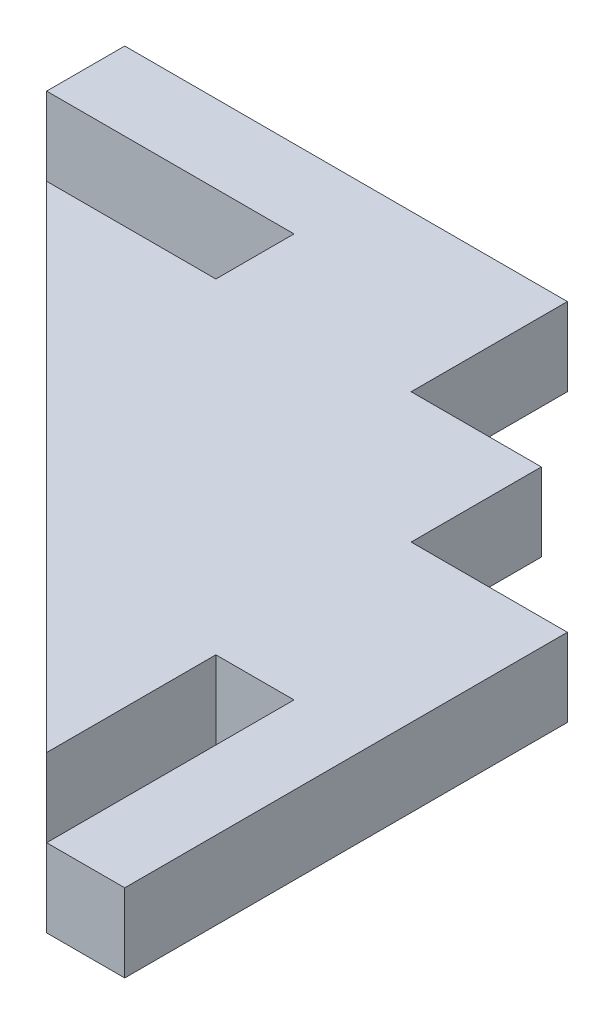
ISO-10303-21;
HEADER;
FILE_DESCRIPTION(('STEP AP214'),'2;1');
FILE_NAME('part.step','',(''),(''),'','','');
FILE_SCHEMA(('AUTOMOTIVE_DESIGN { 1 0 10303 214 1 1 1 1 }'));
ENDSEC;
DATA;
#1=APPLICATION_CONTEXT('core data for automotive mechanical design processes');
#2=APPLICATION_PROTOCOL_DEFINITION('international standard','automotive_design',2000,#1);
#3=PRODUCT_CONTEXT('',#1,'mechanical');
#4=PRODUCT('Part','Part','',(#3));
#5=PRODUCT_RELATED_PRODUCT_CATEGORY('part','',(#4));
#6=PRODUCT_DEFINITION_FORMATION('','',#4);
#7=PRODUCT_DEFINITION_CONTEXT('part definition',#1,'design');
#8=PRODUCT_DEFINITION('design','',#6,#7);
#9=PRODUCT_DEFINITION_SHAPE('','',#8);
#10=(LENGTH_UNIT() NAMED_UNIT(*) SI_UNIT(.MILLI.,.METRE.));
#11=(NAMED_UNIT(*) PLANE_ANGLE_UNIT() SI_UNIT($,.RADIAN.));
#12=(NAMED_UNIT(*) SI_UNIT($,.STERADIAN.) SOLID_ANGLE_UNIT());
#13=UNCERTAINTY_MEASURE_WITH_UNIT(LENGTH_MEASURE(1.E-05),#10,'distance_accuracy_value','');
#14=(GEOMETRIC_REPRESENTATION_CONTEXT(3) GLOBAL_UNCERTAINTY_ASSIGNED_CONTEXT((#13)) GLOBAL_UNIT_ASSIGNED_CONTEXT((#10,
#11,#12)) REPRESENTATION_CONTEXT('',''));
#15=CARTESIAN_POINT('',(0.,0.,0.));
#16=DIRECTION('',(0.,0.,1.));
#17=DIRECTION('',(1.,0.,0.));
#18=AXIS2_PLACEMENT_3D('',#15,#16,#17);
#19=CARTESIAN_POINT('',(0.,6.,10.));
#20=DIRECTION('',(-1.,0.,0.));
#21=DIRECTION('',(0.,0.,1.));
#22=AXIS2_PLACEMENT_3D('',#19,#20,#21);
#23=PLANE('',#22);
#24=DIRECTION('',(0.,0.,-1.));
#25=VECTOR('',#24,1.);
#26=CARTESIAN_POINT('',(0.,0.,10.));
#27=LINE('',#26,#25);
#28=CARTESIAN_POINT('',(0.,0.,10.));
#29=VERTEX_POINT('',#28);
#30=CARTESIAN_POINT('',(0.,0.,0.));
#31=VERTEX_POINT('',#30);
#32=EDGE_CURVE('E223',#29,#31,#27,.T.);
#33=ORIENTED_EDGE('',*,*,#32,.T.);
#34=DIRECTION('',(0.,-1.,0.));
#35=VECTOR('',#34,1.);
#36=CARTESIAN_POINT('',(0.,6.,0.));
#37=LINE('',#36,#35);
#38=CARTESIAN_POINT('',(0.,6.,0.));
#39=VERTEX_POINT('',#38);
#40=EDGE_CURVE('E51',#39,#31,#37,.T.);
#41=ORIENTED_EDGE('',*,*,#40,.F.);
#42=DIRECTION('',(0.,0.,-1.));
#43=VECTOR('',#42,1.);
#44=CARTESIAN_POINT('',(0.,6.,10.));
#45=LINE('',#44,#43);
#46=CARTESIAN_POINT('',(0.,6.,10.));
#47=VERTEX_POINT('',#46);
#48=EDGE_CURVE('E196',#47,#39,#45,.T.);
#49=ORIENTED_EDGE('',*,*,#48,.F.);
#50=DIRECTION('',(0.,-1.,0.));
#51=VECTOR('',#50,1.);
#52=CARTESIAN_POINT('',(0.,6.,10.));
#53=LINE('',#52,#51);
#54=EDGE_CURVE('E197',#47,#29,#53,.T.);
#55=ORIENTED_EDGE('',*,*,#54,.T.);
#56=EDGE_LOOP('',(#33,#41,#49,#55));
#57=FACE_BOUND('',#56,.T.);
#58=ADVANCED_FACE('F43',(#57),#23,.F.);
#59=CARTESIAN_POINT('',(0.,6.,0.));
#60=DIRECTION('',(0.,0.,1.));
#61=DIRECTION('',(1.,0.,0.));
#62=AXIS2_PLACEMENT_3D('',#59,#60,#61);
#63=PLANE('',#62);
#64=DIRECTION('',(-1.,0.,0.));
#65=VECTOR('',#64,1.);
#66=CARTESIAN_POINT('',(0.,0.,0.));
#67=LINE('',#66,#65);
#68=CARTESIAN_POINT('',(-10.,0.,0.));
#69=VERTEX_POINT('',#68);
#70=EDGE_CURVE('E187',#31,#69,#67,.T.);
#71=ORIENTED_EDGE('',*,*,#70,.T.);
#72=DIRECTION('',(0.,-1.,0.));
#73=VECTOR('',#72,1.);
#74=CARTESIAN_POINT('',(-10.,6.,0.));
#75=LINE('',#74,#73);
#76=CARTESIAN_POINT('',(-10.,6.,0.));
#77=VERTEX_POINT('',#76);
#78=EDGE_CURVE('E208',#77,#69,#75,.T.);
#79=ORIENTED_EDGE('',*,*,#78,.F.);
#80=DIRECTION('',(-1.,0.,0.));
#81=VECTOR('',#80,1.);
#82=CARTESIAN_POINT('',(0.,6.,0.));
#83=LINE('',#82,#81);
#84=EDGE_CURVE('E218',#39,#77,#83,.T.);
#85=ORIENTED_EDGE('',*,*,#84,.F.);
#86=ORIENTED_EDGE('',*,*,#40,.T.);
#87=EDGE_LOOP('',(#71,#79,#85,#86));
#88=FACE_BOUND('',#87,.T.);
#89=ADVANCED_FACE('F216',(#88),#63,.F.);
#90=CARTESIAN_POINT('',(-10.,6.,0.));
#91=DIRECTION('',(-1.,0.,0.));
#92=DIRECTION('',(0.,0.,1.));
#93=AXIS2_PLACEMENT_3D('',#90,#91,#92);
#94=PLANE('',#93);
#95=DIRECTION('',(0.,0.,-1.));
#96=VECTOR('',#95,1.);
#97=CARTESIAN_POINT('',(-10.,0.,0.));
#98=LINE('',#97,#96);
#99=CARTESIAN_POINT('',(-10.,0.,-12.));
#100=VERTEX_POINT('',#99);
#101=EDGE_CURVE('E180',#69,#100,#98,.T.);
#102=ORIENTED_EDGE('',*,*,#101,.T.);
#103=DIRECTION('',(0.,-1.,0.));
#104=VECTOR('',#103,1.);
#105=CARTESIAN_POINT('',(-10.,6.,-12.));
#106=LINE('',#105,#104);
#107=CARTESIAN_POINT('',(-10.,6.,-12.));
#108=VERTEX_POINT('',#107);
#109=EDGE_CURVE('E177',#108,#100,#106,.T.);
#110=ORIENTED_EDGE('',*,*,#109,.F.);
#111=DIRECTION('',(0.,0.,-1.));
#112=VECTOR('',#111,1.);
#113=CARTESIAN_POINT('',(-10.,6.,0.));
#114=LINE('',#113,#112);
#115=EDGE_CURVE('E247',#77,#108,#114,.T.);
#116=ORIENTED_EDGE('',*,*,#115,.F.);
#117=ORIENTED_EDGE('',*,*,#78,.T.);
#118=EDGE_LOOP('',(#102,#110,#116,#117));
#119=FACE_BOUND('',#118,.T.);
#120=ADVANCED_FACE('F340',(#119),#94,.F.);
#121=CARTESIAN_POINT('',(-10.,6.,-12.));
#122=DIRECTION('',(0.,0.,1.));
#123=DIRECTION('',(1.,0.,0.));
#124=AXIS2_PLACEMENT_3D('',#121,#122,#123);
#125=PLANE('',#124);
#126=DIRECTION('',(-1.,0.,0.));
#127=VECTOR('',#126,1.);
#128=CARTESIAN_POINT('',(-10.,0.,-12.));
#129=LINE('',#128,#127);
#130=CARTESIAN_POINT('',(-44.,0.,-12.));
#131=VERTEX_POINT('',#130);
#132=EDGE_CURVE('E169',#100,#131,#129,.T.);
#133=ORIENTED_EDGE('',*,*,#132,.T.);
#134=DIRECTION('',(0.,1.,0.));
#135=VECTOR('',#134,1.);
#136=CARTESIAN_POINT('',(-44.,0.,-12.));
#137=LINE('',#136,#135);
#138=CARTESIAN_POINT('',(-44.,6.,-12.));
#139=VERTEX_POINT('',#138);
#140=EDGE_CURVE('E150',#131,#139,#137,.T.);
#141=ORIENTED_EDGE('',*,*,#140,.T.);
#142=DIRECTION('',(-1.,0.,0.));
#143=VECTOR('',#142,1.);
#144=CARTESIAN_POINT('',(-10.,6.,-12.));
#145=LINE('',#144,#143);
#146=EDGE_CURVE('E244',#108,#139,#145,.T.);
#147=ORIENTED_EDGE('',*,*,#146,.F.);
#148=ORIENTED_EDGE('',*,*,#109,.T.);
#149=EDGE_LOOP('',(#133,#141,#147,#148));
#150=FACE_BOUND('',#149,.T.);
#151=ADVANCED_FACE('F175',(#150),#125,.F.);
#152=CARTESIAN_POINT('',(-50.,6.,-12.));
#153=DIRECTION('',(0.707106781186547,0.,-0.707106781186547));
#154=DIRECTION('',(-0.707106781186548,0.,-0.707106781186548));
#155=AXIS2_PLACEMENT_3D('',#152,#153,#154);
#156=PLANE('',#155);
#157=DIRECTION('',(0.707106781186548,0.,0.707106781186548));
#158=VECTOR('',#157,1.);
#159=CARTESIAN_POINT('',(-50.,6.,-12.));
#160=LINE('',#159,#158);
#161=CARTESIAN_POINT('',(-38.,6.,0.));
#162=VERTEX_POINT('',#161);
#163=CARTESIAN_POINT('',(0.,6.,38.));
#164=VERTEX_POINT('',#163);
#165=EDGE_CURVE('E240',#162,#164,#160,.T.);
#166=ORIENTED_EDGE('',*,*,#165,.F.);
#167=DIRECTION('',(0.,-1.,0.));
#168=VECTOR('',#167,1.);
#169=CARTESIAN_POINT('',(-38.,6.,0.));
#170=LINE('',#169,#168);
#171=CARTESIAN_POINT('',(-38.,0.,0.));
#172=VERTEX_POINT('',#171);
#173=EDGE_CURVE('E227',#162,#172,#170,.T.);
#174=ORIENTED_EDGE('',*,*,#173,.T.);
#175=DIRECTION('',(0.707106781186548,0.,0.707106781186548));
#176=VECTOR('',#175,1.);
#177=CARTESIAN_POINT('',(-50.,0.,-12.));
#178=LINE('',#177,#176);
#179=CARTESIAN_POINT('',(0.,0.,38.));
#180=VERTEX_POINT('',#179);
#181=EDGE_CURVE('E179',#172,#180,#178,.T.);
#182=ORIENTED_EDGE('',*,*,#181,.T.);
#183=DIRECTION('',(0.,1.,0.));
#184=VECTOR('',#183,1.);
#185=CARTESIAN_POINT('',(0.,6.,38.));
#186=LINE('',#185,#184);
#187=EDGE_CURVE('E232',#180,#164,#186,.T.);
#188=ORIENTED_EDGE('',*,*,#187,.T.);
#189=EDGE_LOOP('',(#166,#174,#182,#188));
#190=FACE_BOUND('',#189,.T.);
#191=ADVANCED_FACE('F351',(#190),#156,.F.);
#192=CARTESIAN_POINT('',(12.,6.,50.));
#193=DIRECTION('',(-1.,0.,0.));
#194=DIRECTION('',(0.,0.,1.));
#195=AXIS2_PLACEMENT_3D('',#192,#193,#194);
#196=PLANE('',#195);
#197=DIRECTION('',(0.,0.,-1.));
#198=VECTOR('',#197,1.);
#199=CARTESIAN_POINT('',(12.,6.,50.));
#200=LINE('',#199,#198);
#201=CARTESIAN_POINT('',(12.,6.,44.));
#202=VERTEX_POINT('',#201);
#203=CARTESIAN_POINT('',(12.,6.,10.));
#204=VERTEX_POINT('',#203);
#205=EDGE_CURVE('E237',#202,#204,#200,.T.);
#206=ORIENTED_EDGE('',*,*,#205,.F.);
#207=DIRECTION('',(0.,1.,0.));
#208=VECTOR('',#207,1.);
#209=CARTESIAN_POINT('',(12.,0.,44.));
#210=LINE('',#209,#208);
#211=CARTESIAN_POINT('',(12.,0.,44.));
#212=VERTEX_POINT('',#211);
#213=EDGE_CURVE('E316',#212,#202,#210,.T.);
#214=ORIENTED_EDGE('',*,*,#213,.F.);
#215=DIRECTION('',(0.,0.,-1.));
#216=VECTOR('',#215,1.);
#217=CARTESIAN_POINT('',(12.,0.,50.));
#218=LINE('',#217,#216);
#219=CARTESIAN_POINT('',(12.,0.,10.));
#220=VERTEX_POINT('',#219);
#221=EDGE_CURVE('E185',#212,#220,#218,.T.);
#222=ORIENTED_EDGE('',*,*,#221,.T.);
#223=DIRECTION('',(0.,-1.,0.));
#224=VECTOR('',#223,1.);
#225=CARTESIAN_POINT('',(12.,6.,10.));
#226=LINE('',#225,#224);
#227=EDGE_CURVE('E201',#204,#220,#226,.T.);
#228=ORIENTED_EDGE('',*,*,#227,.F.);
#229=EDGE_LOOP('',(#206,#214,#222,#228));
#230=FACE_BOUND('',#229,.T.);
#231=ADVANCED_FACE('F334',(#230),#196,.F.);
#232=CARTESIAN_POINT('',(12.,6.,10.));
#233=DIRECTION('',(0.,0.,1.));
#234=DIRECTION('',(1.,0.,0.));
#235=AXIS2_PLACEMENT_3D('',#232,#233,#234);
#236=PLANE('',#235);
#237=DIRECTION('',(-1.,0.,0.));
#238=VECTOR('',#237,1.);
#239=CARTESIAN_POINT('',(12.,0.,10.));
#240=LINE('',#239,#238);
#241=EDGE_CURVE('E193',#220,#29,#240,.T.);
#242=ORIENTED_EDGE('',*,*,#241,.T.);
#243=ORIENTED_EDGE('',*,*,#54,.F.);
#244=DIRECTION('',(-1.,0.,0.));
#245=VECTOR('',#244,1.);
#246=CARTESIAN_POINT('',(12.,6.,10.));
#247=LINE('',#246,#245);
#248=EDGE_CURVE('E202',#204,#47,#247,.T.);
#249=ORIENTED_EDGE('',*,*,#248,.F.);
#250=ORIENTED_EDGE('',*,*,#227,.T.);
#251=EDGE_LOOP('',(#242,#243,#249,#250));
#252=FACE_BOUND('',#251,.T.);
#253=ADVANCED_FACE('F337',(#252),#236,.F.);
#254=CARTESIAN_POINT('',(0.,6.,0.));
#255=DIRECTION('',(0.,1.,0.));
#256=DIRECTION('',(0.,0.,1.));
#257=AXIS2_PLACEMENT_3D('',#254,#255,#256);
#258=PLANE('',#257);
#259=DIRECTION('',(0.,0.,-1.));
#260=VECTOR('',#259,1.);
#261=CARTESIAN_POINT('',(-44.,6.,-6.));
#262=LINE('',#261,#260);
#263=CARTESIAN_POINT('',(-44.,6.,-6.));
#264=VERTEX_POINT('',#263);
#265=EDGE_CURVE('E156',#264,#139,#262,.T.);
#266=ORIENTED_EDGE('',*,*,#265,.F.);
#267=DIRECTION('',(-1.,0.,0.));
#268=VECTOR('',#267,1.);
#269=CARTESIAN_POINT('',(-44.,6.,-6.));
#270=LINE('',#269,#268);
#271=CARTESIAN_POINT('',(-25.,6.,-6.));
#272=VERTEX_POINT('',#271);
#273=EDGE_CURVE('E297',#272,#264,#270,.T.);
#274=ORIENTED_EDGE('',*,*,#273,.F.);
#275=DIRECTION('',(0.,0.,-1.));
#276=VECTOR('',#275,1.);
#277=CARTESIAN_POINT('',(-25.,6.,-6.));
#278=LINE('',#277,#276);
#279=CARTESIAN_POINT('',(-25.,6.,0.));
#280=VERTEX_POINT('',#279);
#281=EDGE_CURVE('E301',#280,#272,#278,.T.);
#282=ORIENTED_EDGE('',*,*,#281,.F.);
#283=DIRECTION('',(1.,0.,0.));
#284=VECTOR('',#283,1.);
#285=CARTESIAN_POINT('',(-44.,6.,0.));
#286=LINE('',#285,#284);
#287=EDGE_CURVE('E274',#162,#280,#286,.T.);
#288=ORIENTED_EDGE('',*,*,#287,.F.);
#289=ORIENTED_EDGE('',*,*,#165,.T.);
#290=DIRECTION('',(0.,0.,1.));
#291=VECTOR('',#290,1.);
#292=CARTESIAN_POINT('',(0.,6.,44.));
#293=LINE('',#292,#291);
#294=CARTESIAN_POINT('',(0.,6.,25.));
#295=VERTEX_POINT('',#294);
#296=EDGE_CURVE('E262',#295,#164,#293,.T.);
#297=ORIENTED_EDGE('',*,*,#296,.F.);
#298=DIRECTION('',(-1.,0.,0.));
#299=VECTOR('',#298,1.);
#300=CARTESIAN_POINT('',(6.,6.,25.));
#301=LINE('',#300,#299);
#302=CARTESIAN_POINT('',(6.,6.,25.));
#303=VERTEX_POINT('',#302);
#304=EDGE_CURVE('E275',#303,#295,#301,.T.);
#305=ORIENTED_EDGE('',*,*,#304,.F.);
#306=DIRECTION('',(0.,0.,-1.));
#307=VECTOR('',#306,1.);
#308=CARTESIAN_POINT('',(6.,6.,44.));
#309=LINE('',#308,#307);
#310=CARTESIAN_POINT('',(6.,6.,44.));
#311=VERTEX_POINT('',#310);
#312=EDGE_CURVE('E270',#311,#303,#309,.T.);
#313=ORIENTED_EDGE('',*,*,#312,.F.);
#314=DIRECTION('',(-1.,0.,0.));
#315=VECTOR('',#314,1.);
#316=CARTESIAN_POINT('',(6.,6.,44.));
#317=LINE('',#316,#315);
#318=EDGE_CURVE('E315',#202,#311,#317,.T.);
#319=ORIENTED_EDGE('',*,*,#318,.F.);
#320=ORIENTED_EDGE('',*,*,#205,.T.);
#321=ORIENTED_EDGE('',*,*,#248,.T.);
#322=ORIENTED_EDGE('',*,*,#48,.T.);
#323=ORIENTED_EDGE('',*,*,#84,.T.);
#324=ORIENTED_EDGE('',*,*,#115,.T.);
#325=ORIENTED_EDGE('',*,*,#146,.T.);
#326=EDGE_LOOP('',(#266,#274,#282,#288,#289,#297,#305,#313,#319,#320,#321,#322,#323,#324,#325));
#327=FACE_BOUND('',#326,.T.);
#328=ADVANCED_FACE('F331',(#327),#258,.T.);
#329=CARTESIAN_POINT('',(0.,0.,0.));
#330=DIRECTION('',(0.,1.,0.));
#331=DIRECTION('',(0.,0.,1.));
#332=AXIS2_PLACEMENT_3D('',#329,#330,#331);
#333=PLANE('',#332);
#334=DIRECTION('',(-1.,0.,0.));
#335=VECTOR('',#334,1.);
#336=CARTESIAN_POINT('',(-44.,0.,-6.));
#337=LINE('',#336,#335);
#338=CARTESIAN_POINT('',(-25.,0.,-6.));
#339=VERTEX_POINT('',#338);
#340=CARTESIAN_POINT('',(-44.,0.,-6.));
#341=VERTEX_POINT('',#340);
#342=EDGE_CURVE('E171',#339,#341,#337,.T.);
#343=ORIENTED_EDGE('',*,*,#342,.T.);
#344=DIRECTION('',(0.,0.,-1.));
#345=VECTOR('',#344,1.);
#346=CARTESIAN_POINT('',(-44.,0.,-6.));
#347=LINE('',#346,#345);
#348=EDGE_CURVE('E153',#341,#131,#347,.T.);
#349=ORIENTED_EDGE('',*,*,#348,.T.);
#350=ORIENTED_EDGE('',*,*,#132,.F.);
#351=ORIENTED_EDGE('',*,*,#101,.F.);
#352=ORIENTED_EDGE('',*,*,#70,.F.);
#353=ORIENTED_EDGE('',*,*,#32,.F.);
#354=ORIENTED_EDGE('',*,*,#241,.F.);
#355=ORIENTED_EDGE('',*,*,#221,.F.);
#356=DIRECTION('',(-1.,0.,0.));
#357=VECTOR('',#356,1.);
#358=CARTESIAN_POINT('',(6.,0.,44.));
#359=LINE('',#358,#357);
#360=CARTESIAN_POINT('',(6.,0.,44.));
#361=VERTEX_POINT('',#360);
#362=EDGE_CURVE('E311',#212,#361,#359,.T.);
#363=ORIENTED_EDGE('',*,*,#362,.T.);
#364=DIRECTION('',(0.,0.,-1.));
#365=VECTOR('',#364,1.);
#366=CARTESIAN_POINT('',(6.,0.,44.));
#367=LINE('',#366,#365);
#368=CARTESIAN_POINT('',(6.,0.,25.));
#369=VERTEX_POINT('',#368);
#370=EDGE_CURVE('E258',#361,#369,#367,.T.);
#371=ORIENTED_EDGE('',*,*,#370,.T.);
#372=DIRECTION('',(-1.,0.,0.));
#373=VECTOR('',#372,1.);
#374=CARTESIAN_POINT('',(6.,0.,25.));
#375=LINE('',#374,#373);
#376=CARTESIAN_POINT('',(0.,0.,25.));
#377=VERTEX_POINT('',#376);
#378=EDGE_CURVE('E263',#369,#377,#375,.T.);
#379=ORIENTED_EDGE('',*,*,#378,.T.);
#380=DIRECTION('',(0.,0.,1.));
#381=VECTOR('',#380,1.);
#382=CARTESIAN_POINT('',(0.,0.,44.));
#383=LINE('',#382,#381);
#384=EDGE_CURVE('E66',#377,#180,#383,.T.);
#385=ORIENTED_EDGE('',*,*,#384,.T.);
#386=ORIENTED_EDGE('',*,*,#181,.F.);
#387=DIRECTION('',(1.,0.,0.));
#388=VECTOR('',#387,1.);
#389=CARTESIAN_POINT('',(0.,0.,0.));
#390=LINE('',#389,#388);
#391=CARTESIAN_POINT('',(-25.,0.,0.));
#392=VERTEX_POINT('',#391);
#393=EDGE_CURVE('E11',#172,#392,#390,.T.);
#394=ORIENTED_EDGE('',*,*,#393,.T.);
#395=DIRECTION('',(0.,0.,-1.));
#396=VECTOR('',#395,1.);
#397=CARTESIAN_POINT('',(-25.,0.,-6.));
#398=LINE('',#397,#396);
#399=EDGE_CURVE('E58',#392,#339,#398,.T.);
#400=ORIENTED_EDGE('',*,*,#399,.T.);
#401=EDGE_LOOP('',(#343,#349,#350,#351,#352,#353,#354,#355,#363,#371,#379,#385,#386,#394,#400));
#402=FACE_BOUND('',#401,.T.);
#403=ADVANCED_FACE('F167',(#402),#333,.F.);
#404=CARTESIAN_POINT('',(0.,0.,44.));
#405=DIRECTION('',(-1.,0.,0.));
#406=DIRECTION('',(0.,0.,1.));
#407=AXIS2_PLACEMENT_3D('',#404,#405,#406);
#408=PLANE('',#407);
#409=ORIENTED_EDGE('',*,*,#384,.F.);
#410=DIRECTION('',(0.,1.,0.));
#411=VECTOR('',#410,1.);
#412=CARTESIAN_POINT('',(0.,0.,25.));
#413=LINE('',#412,#411);
#414=EDGE_CURVE('E284',#377,#295,#413,.T.);
#415=ORIENTED_EDGE('',*,*,#414,.T.);
#416=ORIENTED_EDGE('',*,*,#296,.T.);
#417=ORIENTED_EDGE('',*,*,#187,.F.);
#418=EDGE_LOOP('',(#409,#415,#416,#417));
#419=FACE_BOUND('',#418,.T.);
#420=ADVANCED_FACE('F353',(#419),#408,.F.);
#421=CARTESIAN_POINT('',(6.,0.,44.));
#422=DIRECTION('',(1.,0.,0.));
#423=DIRECTION('',(0.,0.,-1.));
#424=AXIS2_PLACEMENT_3D('',#421,#422,#423);
#425=PLANE('',#424);
#426=ORIENTED_EDGE('',*,*,#312,.T.);
#427=DIRECTION('',(0.,1.,0.));
#428=VECTOR('',#427,1.);
#429=CARTESIAN_POINT('',(6.,0.,25.));
#430=LINE('',#429,#428);
#431=EDGE_CURVE('E269',#369,#303,#430,.T.);
#432=ORIENTED_EDGE('',*,*,#431,.F.);
#433=ORIENTED_EDGE('',*,*,#370,.F.);
#434=DIRECTION('',(0.,1.,0.));
#435=VECTOR('',#434,1.);
#436=CARTESIAN_POINT('',(6.,0.,44.));
#437=LINE('',#436,#435);
#438=EDGE_CURVE('E162',#361,#311,#437,.T.);
#439=ORIENTED_EDGE('',*,*,#438,.T.);
#440=EDGE_LOOP('',(#426,#432,#433,#439));
#441=FACE_BOUND('',#440,.T.);
#442=ADVANCED_FACE('F359',(#441),#425,.F.);
#443=CARTESIAN_POINT('',(6.,0.,25.));
#444=DIRECTION('',(0.,0.,-1.));
#445=DIRECTION('',(-1.,0.,0.));
#446=AXIS2_PLACEMENT_3D('',#443,#444,#445);
#447=PLANE('',#446);
#448=ORIENTED_EDGE('',*,*,#304,.T.);
#449=ORIENTED_EDGE('',*,*,#414,.F.);
#450=ORIENTED_EDGE('',*,*,#378,.F.);
#451=ORIENTED_EDGE('',*,*,#431,.T.);
#452=EDGE_LOOP('',(#448,#449,#450,#451));
#453=FACE_BOUND('',#452,.T.);
#454=ADVANCED_FACE('F357',(#453),#447,.F.);
#455=CARTESIAN_POINT('',(-44.,0.,0.));
#456=DIRECTION('',(0.,0.,1.));
#457=DIRECTION('',(1.,0.,0.));
#458=AXIS2_PLACEMENT_3D('',#455,#456,#457);
#459=PLANE('',#458);
#460=ORIENTED_EDGE('',*,*,#287,.T.);
#461=DIRECTION('',(0.,1.,0.));
#462=VECTOR('',#461,1.);
#463=CARTESIAN_POINT('',(-25.,0.,0.));
#464=LINE('',#463,#462);
#465=EDGE_CURVE('E289',#392,#280,#464,.T.);
#466=ORIENTED_EDGE('',*,*,#465,.F.);
#467=ORIENTED_EDGE('',*,*,#393,.F.);
#468=ORIENTED_EDGE('',*,*,#173,.F.);
#469=EDGE_LOOP('',(#460,#466,#467,#468));
#470=FACE_BOUND('',#469,.T.);
#471=ADVANCED_FACE('F366',(#470),#459,.F.);
#472=CARTESIAN_POINT('',(-44.,0.,-6.));
#473=DIRECTION('',(0.,0.,-1.));
#474=DIRECTION('',(-1.,0.,0.));
#475=AXIS2_PLACEMENT_3D('',#472,#473,#474);
#476=PLANE('',#475);
#477=ORIENTED_EDGE('',*,*,#273,.T.);
#478=DIRECTION('',(0.,1.,0.));
#479=VECTOR('',#478,1.);
#480=CARTESIAN_POINT('',(-44.,0.,-6.));
#481=LINE('',#480,#479);
#482=EDGE_CURVE('E257',#341,#264,#481,.T.);
#483=ORIENTED_EDGE('',*,*,#482,.F.);
#484=ORIENTED_EDGE('',*,*,#342,.F.);
#485=DIRECTION('',(0.,1.,0.));
#486=VECTOR('',#485,1.);
#487=CARTESIAN_POINT('',(-25.,0.,-6.));
#488=LINE('',#487,#486);
#489=EDGE_CURVE('E292',#339,#272,#488,.T.);
#490=ORIENTED_EDGE('',*,*,#489,.T.);
#491=EDGE_LOOP('',(#477,#483,#484,#490));
#492=FACE_BOUND('',#491,.T.);
#493=ADVANCED_FACE('F344',(#492),#476,.F.);
#494=CARTESIAN_POINT('',(-25.,0.,-6.));
#495=DIRECTION('',(1.,0.,0.));
#496=DIRECTION('',(0.,0.,-1.));
#497=AXIS2_PLACEMENT_3D('',#494,#495,#496);
#498=PLANE('',#497);
#499=ORIENTED_EDGE('',*,*,#281,.T.);
#500=ORIENTED_EDGE('',*,*,#489,.F.);
#501=ORIENTED_EDGE('',*,*,#399,.F.);
#502=ORIENTED_EDGE('',*,*,#465,.T.);
#503=EDGE_LOOP('',(#499,#500,#501,#502));
#504=FACE_BOUND('',#503,.T.);
#505=ADVANCED_FACE('F345',(#504),#498,.F.);
#506=CARTESIAN_POINT('',(-44.,0.,-6.));
#507=DIRECTION('',(1.,0.,0.));
#508=DIRECTION('',(0.,0.,-1.));
#509=AXIS2_PLACEMENT_3D('',#506,#507,#508);
#510=PLANE('',#509);
#511=ORIENTED_EDGE('',*,*,#265,.T.);
#512=ORIENTED_EDGE('',*,*,#140,.F.);
#513=ORIENTED_EDGE('',*,*,#348,.F.);
#514=ORIENTED_EDGE('',*,*,#482,.T.);
#515=EDGE_LOOP('',(#511,#512,#513,#514));
#516=FACE_BOUND('',#515,.T.);
#517=ADVANCED_FACE('F152',(#516),#510,.F.);
#518=CARTESIAN_POINT('',(6.,0.,44.));
#519=DIRECTION('',(0.,0.,-1.));
#520=DIRECTION('',(-1.,0.,0.));
#521=AXIS2_PLACEMENT_3D('',#518,#519,#520);
#522=PLANE('',#521);
#523=ORIENTED_EDGE('',*,*,#318,.T.);
#524=ORIENTED_EDGE('',*,*,#438,.F.);
#525=ORIENTED_EDGE('',*,*,#362,.F.);
#526=ORIENTED_EDGE('',*,*,#213,.T.);
#527=EDGE_LOOP('',(#523,#524,#525,#526));
#528=FACE_BOUND('',#527,.T.);
#529=ADVANCED_FACE('F325',(#528),#522,.F.);
#530=CLOSED_SHELL('',(#58,#89,#120,#151,#191,#231,#253,#328,#403,#420,#442,#454,#471,#493,#505,
#517,#529));
#531=MANIFOLD_SOLID_BREP('B2',#530);
#532=ADVANCED_BREP_SHAPE_REPRESENTATION('',(#18,#531),#14);
#533=SHAPE_DEFINITION_REPRESENTATION(#9,#532);
ENDSEC;
END-ISO-10303-21;
